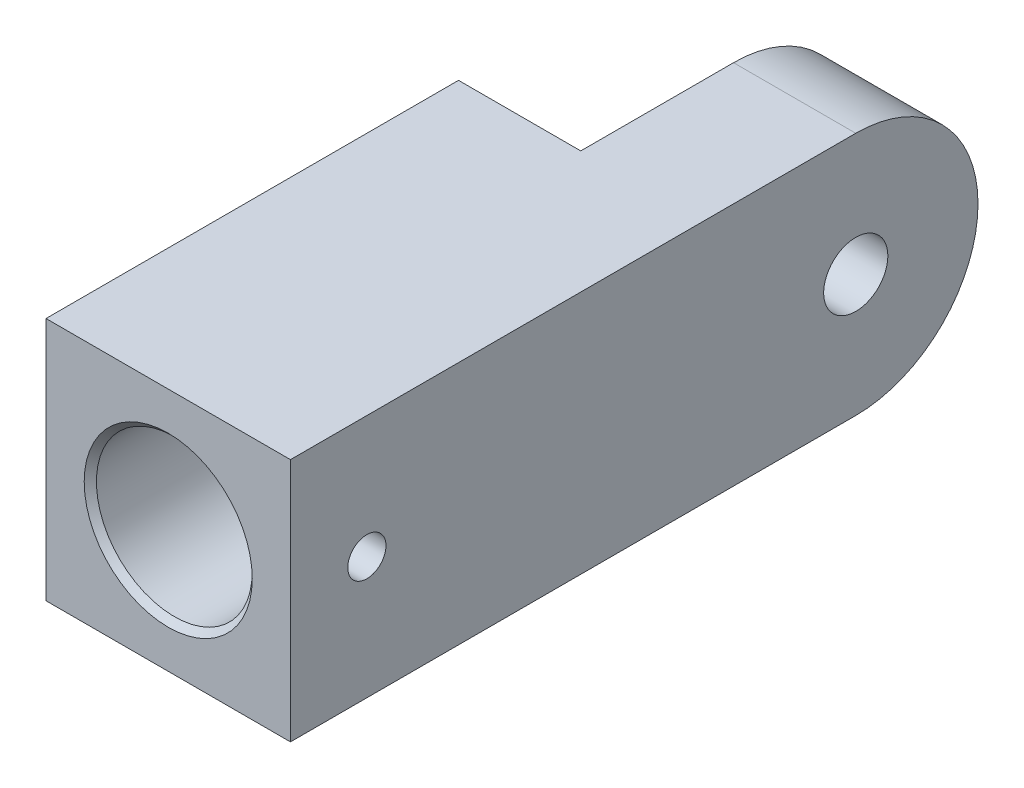
ISO-10303-21;
HEADER;
FILE_DESCRIPTION(('STEP AP214'),'2;1');
FILE_NAME('part.step','',(''),(''),'','','');
FILE_SCHEMA(('AUTOMOTIVE_DESIGN { 1 0 10303 214 1 1 1 1 }'));
ENDSEC;
DATA;
#1=APPLICATION_CONTEXT('core data for automotive mechanical design processes');
#2=APPLICATION_PROTOCOL_DEFINITION('international standard','automotive_design',2000,#1);
#3=PRODUCT_CONTEXT('',#1,'mechanical');
#4=PRODUCT('Part','Part','',(#3));
#5=PRODUCT_RELATED_PRODUCT_CATEGORY('part','',(#4));
#6=PRODUCT_DEFINITION_FORMATION('','',#4);
#7=PRODUCT_DEFINITION_CONTEXT('part definition',#1,'design');
#8=PRODUCT_DEFINITION('design','',#6,#7);
#9=PRODUCT_DEFINITION_SHAPE('','',#8);
#10=(LENGTH_UNIT() NAMED_UNIT(*) SI_UNIT(.MILLI.,.METRE.));
#11=(NAMED_UNIT(*) PLANE_ANGLE_UNIT() SI_UNIT($,.RADIAN.));
#12=(NAMED_UNIT(*) SI_UNIT($,.STERADIAN.) SOLID_ANGLE_UNIT());
#13=UNCERTAINTY_MEASURE_WITH_UNIT(LENGTH_MEASURE(1.E-05),#10,'distance_accuracy_value','');
#14=(GEOMETRIC_REPRESENTATION_CONTEXT(3) GLOBAL_UNCERTAINTY_ASSIGNED_CONTEXT((#13)) GLOBAL_UNIT_ASSIGNED_CONTEXT((#10,
#11,#12)) REPRESENTATION_CONTEXT('',''));
#15=CARTESIAN_POINT('',(0.,0.,0.));
#16=DIRECTION('',(0.,0.,1.));
#17=DIRECTION('',(1.,0.,0.));
#18=AXIS2_PLACEMENT_3D('',#15,#16,#17);
#19=CARTESIAN_POINT('',(8.,8.,45.));
#20=DIRECTION('',(0.,-1.,0.));
#21=DIRECTION('',(1.,0.,0.));
#22=AXIS2_PLACEMENT_3D('',#19,#20,#21);
#23=PLANE('',#22);
#24=DIRECTION('',(-1.,0.,0.));
#25=VECTOR('',#24,1.);
#26=CARTESIAN_POINT('',(8.,8.,8.));
#27=LINE('',#26,#25);
#28=CARTESIAN_POINT('',(8.,8.,8.));
#29=VERTEX_POINT('',#28);
#30=CARTESIAN_POINT('',(0.,8.,8.));
#31=VERTEX_POINT('',#30);
#32=EDGE_CURVE('E124',#29,#31,#27,.T.);
#33=ORIENTED_EDGE('',*,*,#32,.T.);
#34=DIRECTION('',(0.,0.,-1.));
#35=VECTOR('',#34,1.);
#36=CARTESIAN_POINT('',(0.,8.,0.));
#37=LINE('',#36,#35);
#38=CARTESIAN_POINT('',(0.,8.,18.));
#39=VERTEX_POINT('',#38);
#40=EDGE_CURVE('E138',#39,#31,#37,.T.);
#41=ORIENTED_EDGE('',*,*,#40,.F.);
#42=DIRECTION('',(1.,0.,0.));
#43=VECTOR('',#42,1.);
#44=CARTESIAN_POINT('',(-8.,8.,18.));
#45=LINE('',#44,#43);
#46=CARTESIAN_POINT('',(-8.,8.,18.));
#47=VERTEX_POINT('',#46);
#48=EDGE_CURVE('E134',#47,#39,#45,.T.);
#49=ORIENTED_EDGE('',*,*,#48,.F.);
#50=DIRECTION('',(0.,0.,-1.));
#51=VECTOR('',#50,1.);
#52=CARTESIAN_POINT('',(-8.,8.,45.));
#53=LINE('',#52,#51);
#54=CARTESIAN_POINT('',(-8.,8.,45.));
#55=VERTEX_POINT('',#54);
#56=EDGE_CURVE('E153',#55,#47,#53,.T.);
#57=ORIENTED_EDGE('',*,*,#56,.F.);
#58=DIRECTION('',(-1.,0.,0.));
#59=VECTOR('',#58,1.);
#60=CARTESIAN_POINT('',(8.,8.,45.));
#61=LINE('',#60,#59);
#62=CARTESIAN_POINT('',(8.,8.,45.));
#63=VERTEX_POINT('',#62);
#64=EDGE_CURVE('E58',#63,#55,#61,.T.);
#65=ORIENTED_EDGE('',*,*,#64,.F.);
#66=DIRECTION('',(0.,0.,-1.));
#67=VECTOR('',#66,1.);
#68=CARTESIAN_POINT('',(8.,8.,45.));
#69=LINE('',#68,#67);
#70=EDGE_CURVE('E156',#63,#29,#69,.T.);
#71=ORIENTED_EDGE('',*,*,#70,.T.);
#72=EDGE_LOOP('',(#33,#41,#49,#57,#65,#71));
#73=FACE_BOUND('',#72,.T.);
#74=ADVANCED_FACE('F36',(#73),#23,.F.);
#75=CARTESIAN_POINT('',(-8.,8.,45.));
#76=DIRECTION('',(1.,0.,0.));
#77=DIRECTION('',(0.,1.,0.));
#78=AXIS2_PLACEMENT_3D('',#75,#76,#77);
#79=PLANE('',#78);
#80=ORIENTED_EDGE('',*,*,#56,.T.);
#81=DIRECTION('',(0.,-1.,0.));
#82=VECTOR('',#81,1.);
#83=CARTESIAN_POINT('',(-8.,0.,18.));
#84=LINE('',#83,#82);
#85=CARTESIAN_POINT('',(-8.,-8.,18.));
#86=VERTEX_POINT('',#85);
#87=EDGE_CURVE('E131',#47,#86,#84,.T.);
#88=ORIENTED_EDGE('',*,*,#87,.T.);
#89=DIRECTION('',(0.,0.,-1.));
#90=VECTOR('',#89,1.);
#91=CARTESIAN_POINT('',(-8.,-8.,45.));
#92=LINE('',#91,#90);
#93=CARTESIAN_POINT('',(-8.,-8.,45.));
#94=VERTEX_POINT('',#93);
#95=EDGE_CURVE('E50',#94,#86,#92,.T.);
#96=ORIENTED_EDGE('',*,*,#95,.F.);
#97=DIRECTION('',(0.,-1.,0.));
#98=VECTOR('',#97,1.);
#99=CARTESIAN_POINT('',(-8.,8.,45.));
#100=LINE('',#99,#98);
#101=EDGE_CURVE('E146',#55,#94,#100,.T.);
#102=ORIENTED_EDGE('',*,*,#101,.F.);
#103=EDGE_LOOP('',(#80,#88,#96,#102));
#104=FACE_BOUND('',#103,.T.);
#105=ADVANCED_FACE('F38',(#104),#79,.F.);
#106=CARTESIAN_POINT('',(8.,-8.,45.));
#107=DIRECTION('',(0.,1.,0.));
#108=DIRECTION('',(-1.,0.,0.));
#109=AXIS2_PLACEMENT_3D('',#106,#107,#108);
#110=PLANE('',#109);
#111=DIRECTION('',(0.,0.,-1.));
#112=VECTOR('',#111,1.);
#113=CARTESIAN_POINT('',(0.,-8.,0.));
#114=LINE('',#113,#112);
#115=CARTESIAN_POINT('',(0.,-8.,18.));
#116=VERTEX_POINT('',#115);
#117=CARTESIAN_POINT('',(0.,-8.,8.));
#118=VERTEX_POINT('',#117);
#119=EDGE_CURVE('E130',#116,#118,#114,.T.);
#120=ORIENTED_EDGE('',*,*,#119,.T.);
#121=DIRECTION('',(-1.,0.,0.));
#122=VECTOR('',#121,1.);
#123=CARTESIAN_POINT('',(8.,-8.,8.));
#124=LINE('',#123,#122);
#125=CARTESIAN_POINT('',(8.,-8.,8.));
#126=VERTEX_POINT('',#125);
#127=EDGE_CURVE('E127',#126,#118,#124,.T.);
#128=ORIENTED_EDGE('',*,*,#127,.F.);
#129=DIRECTION('',(0.,0.,-1.));
#130=VECTOR('',#129,1.);
#131=CARTESIAN_POINT('',(8.,-8.,45.));
#132=LINE('',#131,#130);
#133=CARTESIAN_POINT('',(8.,-8.,45.));
#134=VERTEX_POINT('',#133);
#135=EDGE_CURVE('E159',#134,#126,#132,.T.);
#136=ORIENTED_EDGE('',*,*,#135,.F.);
#137=DIRECTION('',(1.,0.,0.));
#138=VECTOR('',#137,1.);
#139=CARTESIAN_POINT('',(8.,-8.,45.));
#140=LINE('',#139,#138);
#141=EDGE_CURVE('E149',#94,#134,#140,.T.);
#142=ORIENTED_EDGE('',*,*,#141,.F.);
#143=ORIENTED_EDGE('',*,*,#95,.T.);
#144=DIRECTION('',(1.,0.,0.));
#145=VECTOR('',#144,1.);
#146=CARTESIAN_POINT('',(-8.,-8.,18.));
#147=LINE('',#146,#145);
#148=EDGE_CURVE('E143',#86,#116,#147,.T.);
#149=ORIENTED_EDGE('',*,*,#148,.T.);
#150=EDGE_LOOP('',(#120,#128,#136,#142,#143,#149));
#151=FACE_BOUND('',#150,.T.);
#152=ADVANCED_FACE('F188',(#151),#110,.F.);
#153=CARTESIAN_POINT('',(8.,8.,45.));
#154=DIRECTION('',(-1.,0.,0.));
#155=DIRECTION('',(0.,0.,1.));
#156=AXIS2_PLACEMENT_3D('',#153,#154,#155);
#157=PLANE('',#156);
#158=CARTESIAN_POINT('',(8.,0.,40.));
#159=DIRECTION('',(1.,0.,0.));
#160=DIRECTION('',(0.,0.,-1.));
#161=AXIS2_PLACEMENT_3D('',#158,#159,#160);
#162=CIRCLE('',#161,1.25);
#163=CARTESIAN_POINT('',(8.,0.,38.75));
#164=VERTEX_POINT('',#163);
#165=EDGE_CURVE('E109',#164,#164,#162,.T.);
#166=ORIENTED_EDGE('',*,*,#165,.F.);
#167=EDGE_LOOP('',(#166));
#168=FACE_BOUND('',#167,.T.);
#169=CARTESIAN_POINT('',(8.,0.,8.));
#170=DIRECTION('',(1.,0.,0.));
#171=DIRECTION('',(0.,0.,-1.));
#172=AXIS2_PLACEMENT_3D('',#169,#170,#171);
#173=CIRCLE('',#172,2.1);
#174=CARTESIAN_POINT('',(8.,0.,5.9));
#175=VERTEX_POINT('',#174);
#176=EDGE_CURVE('E117',#175,#175,#173,.T.);
#177=ORIENTED_EDGE('',*,*,#176,.F.);
#178=EDGE_LOOP('',(#177));
#179=FACE_BOUND('',#178,.T.);
#180=ORIENTED_EDGE('',*,*,#135,.T.);
#181=CARTESIAN_POINT('',(8.,0.,8.));
#182=DIRECTION('',(1.,0.,0.));
#183=DIRECTION('',(0.,0.,-1.));
#184=AXIS2_PLACEMENT_3D('',#181,#182,#183);
#185=CIRCLE('',#184,8.);
#186=EDGE_CURVE('E121',#126,#29,#185,.T.);
#187=ORIENTED_EDGE('',*,*,#186,.T.);
#188=ORIENTED_EDGE('',*,*,#70,.F.);
#189=DIRECTION('',(0.,1.,0.));
#190=VECTOR('',#189,1.);
#191=CARTESIAN_POINT('',(8.,8.,45.));
#192=LINE('',#191,#190);
#193=EDGE_CURVE('E63',#134,#63,#192,.T.);
#194=ORIENTED_EDGE('',*,*,#193,.F.);
#195=EDGE_LOOP('',(#180,#187,#188,#194));
#196=FACE_BOUND('',#195,.T.);
#197=ADVANCED_FACE('F194',(#168,#179,#196),#157,.F.);
#198=CARTESIAN_POINT('',(0.,0.,45.));
#199=DIRECTION('',(0.,0.,-1.));
#200=DIRECTION('',(-1.,0.,0.));
#201=AXIS2_PLACEMENT_3D('',#198,#199,#200);
#202=PLANE('',#201);
#203=CARTESIAN_POINT('',(0.,0.,45.));
#204=DIRECTION('',(0.,0.,1.));
#205=DIRECTION('',(1.,0.,0.));
#206=AXIS2_PLACEMENT_3D('',#203,#204,#205);
#207=CIRCLE('',#206,5.5);
#208=CARTESIAN_POINT('',(5.5,0.,45.));
#209=VERTEX_POINT('',#208);
#210=EDGE_CURVE('E111',#209,#209,#207,.T.);
#211=ORIENTED_EDGE('',*,*,#210,.F.);
#212=EDGE_LOOP('',(#211));
#213=FACE_BOUND('',#212,.T.);
#214=ORIENTED_EDGE('',*,*,#101,.T.);
#215=ORIENTED_EDGE('',*,*,#141,.T.);
#216=ORIENTED_EDGE('',*,*,#193,.T.);
#217=ORIENTED_EDGE('',*,*,#64,.T.);
#218=EDGE_LOOP('',(#214,#215,#216,#217));
#219=FACE_BOUND('',#218,.T.);
#220=ADVANCED_FACE('F192',(#213,#219),#202,.F.);
#221=CARTESIAN_POINT('',(-8.,0.,18.));
#222=DIRECTION('',(0.,0.,1.));
#223=DIRECTION('',(0.,-1.,0.));
#224=AXIS2_PLACEMENT_3D('',#221,#222,#223);
#225=PLANE('',#224);
#226=DIRECTION('',(0.,-1.,0.));
#227=VECTOR('',#226,1.);
#228=CARTESIAN_POINT('',(0.,0.,18.));
#229=LINE('',#228,#227);
#230=EDGE_CURVE('E135',#39,#116,#229,.T.);
#231=ORIENTED_EDGE('',*,*,#230,.T.);
#232=ORIENTED_EDGE('',*,*,#148,.F.);
#233=ORIENTED_EDGE('',*,*,#87,.F.);
#234=ORIENTED_EDGE('',*,*,#48,.T.);
#235=EDGE_LOOP('',(#231,#232,#233,#234));
#236=FACE_BOUND('',#235,.T.);
#237=ADVANCED_FACE('F206',(#236),#225,.F.);
#238=CARTESIAN_POINT('',(0.,0.,0.));
#239=DIRECTION('',(1.,0.,0.));
#240=DIRECTION('',(0.,0.,-1.));
#241=AXIS2_PLACEMENT_3D('',#238,#239,#240);
#242=PLANE('',#241);
#243=CARTESIAN_POINT('',(0.,0.,8.));
#244=DIRECTION('',(1.,0.,0.));
#245=DIRECTION('',(0.,0.,-1.));
#246=AXIS2_PLACEMENT_3D('',#243,#244,#245);
#247=CIRCLE('',#246,2.1);
#248=CARTESIAN_POINT('',(0.,0.,5.9));
#249=VERTEX_POINT('',#248);
#250=EDGE_CURVE('E120',#249,#249,#247,.T.);
#251=ORIENTED_EDGE('',*,*,#250,.T.);
#252=EDGE_LOOP('',(#251));
#253=FACE_BOUND('',#252,.T.);
#254=CARTESIAN_POINT('',(0.,0.,8.));
#255=DIRECTION('',(1.,0.,0.));
#256=DIRECTION('',(0.,0.,-1.));
#257=AXIS2_PLACEMENT_3D('',#254,#255,#256);
#258=CIRCLE('',#257,8.);
#259=EDGE_CURVE('E11',#31,#118,#258,.F.);
#260=ORIENTED_EDGE('',*,*,#259,.T.);
#261=ORIENTED_EDGE('',*,*,#119,.F.);
#262=ORIENTED_EDGE('',*,*,#230,.F.);
#263=ORIENTED_EDGE('',*,*,#40,.T.);
#264=EDGE_LOOP('',(#260,#261,#262,#263));
#265=FACE_BOUND('',#264,.T.);
#266=ADVANCED_FACE('F166',(#253,#265),#242,.F.);
#267=CARTESIAN_POINT('',(8.,0.,8.));
#268=DIRECTION('',(-1.,0.,0.));
#269=DIRECTION('',(0.,0.,1.));
#270=AXIS2_PLACEMENT_3D('',#267,#268,#269);
#271=CYLINDRICAL_SURFACE('',#270,8.);
#272=ORIENTED_EDGE('',*,*,#259,.F.);
#273=ORIENTED_EDGE('',*,*,#32,.F.);
#274=ORIENTED_EDGE('',*,*,#186,.F.);
#275=ORIENTED_EDGE('',*,*,#127,.T.);
#276=EDGE_LOOP('',(#272,#273,#274,#275));
#277=FACE_BOUND('',#276,.T.);
#278=ADVANCED_FACE('F172',(#277),#271,.T.);
#279=CARTESIAN_POINT('',(8.,0.,8.));
#280=DIRECTION('',(1.,0.,0.));
#281=DIRECTION('',(0.,0.,-1.));
#282=AXIS2_PLACEMENT_3D('',#279,#280,#281);
#283=CYLINDRICAL_SURFACE('',#282,2.1);
#284=ORIENTED_EDGE('',*,*,#176,.T.);
#285=EDGE_LOOP('',(#284));
#286=FACE_BOUND('',#285,.T.);
#287=ORIENTED_EDGE('',*,*,#250,.F.);
#288=EDGE_LOOP('',(#287));
#289=FACE_BOUND('',#288,.T.);
#290=ADVANCED_FACE('F169',(#286,#289),#283,.F.);
#291=CARTESIAN_POINT('',(8.,0.,40.));
#292=DIRECTION('',(1.,0.,0.));
#293=DIRECTION('',(0.,0.,-1.));
#294=AXIS2_PLACEMENT_3D('',#291,#292,#293);
#295=CYLINDRICAL_SURFACE('',#294,1.25);
#296=CARTESIAN_POINT('',(5.1,0.,38.75));
#297=CARTESIAN_POINT('',(5.09999880434979,-0.0691070684996925,38.7500020165109));
#298=CARTESIAN_POINT('',(5.09858131536653,-0.138236944418446,38.7557502377163));
#299=CARTESIAN_POINT('',(5.09306394414273,-0.274518328542682,38.7785585629587));
#300=CARTESIAN_POINT('',(5.08896247642348,-0.34166864286499,38.7956253531758));
#301=CARTESIAN_POINT('',(5.07853173481307,-0.472002952228093,38.8404925553834));
#302=CARTESIAN_POINT('',(5.07220508043732,-0.535191508483105,38.8682803501969));
#303=CARTESIAN_POINT('',(5.05799923545459,-0.656009783807288,38.9337570747495));
#304=CARTESIAN_POINT('',(5.05012000732641,-0.71363936848209,38.9714462437834));
#305=CARTESIAN_POINT('',(5.03349079831523,-0.822848252966838,39.0564464383293));
#306=CARTESIAN_POINT('',(5.02472780422834,-0.874301457474937,39.1039169353936));
#307=CARTESIAN_POINT('',(5.00740600303306,-0.96860149051342,39.2067906907256));
#308=CARTESIAN_POINT('',(4.99884721820992,-1.01144738348377,39.2621948102078));
#309=CARTESIAN_POINT('',(4.98277220490615,-1.0879035028578,39.3803344515879));
#310=CARTESIAN_POINT('',(4.9752725239875,-1.1213738013313,39.4431629859324));
#311=CARTESIAN_POINT('',(4.96235417524496,-1.17722916418205,39.5737681418392));
#312=CARTESIAN_POINT('',(4.95693518890104,-1.1996159254181,39.6415440041553));
#313=CARTESIAN_POINT('',(4.94892534918552,-1.23224077227212,39.7787363247121));
#314=CARTESIAN_POINT('',(4.94628192270403,-1.24270502580646,39.8480958595413));
#315=CARTESIAN_POINT('',(4.94396505119134,-1.2518920997985,39.9876324709265));
#316=CARTESIAN_POINT('',(4.94429114286616,-1.25061675182797,40.0578094182464));
#317=CARTESIAN_POINT('',(4.94782914866116,-1.23654152995141,40.1952641722533));
#318=CARTESIAN_POINT('',(4.9509738595344,-1.22401001756152,40.2625714574792));
#319=CARTESIAN_POINT('',(4.95968781619626,-1.18820580162089,40.3940980498247));
#320=CARTESIAN_POINT('',(4.9652572287173,-1.16493235940441,40.4583171442504));
#321=CARTESIAN_POINT('',(4.97825548132943,-1.10807335491485,40.5825697258023));
#322=CARTESIAN_POINT('',(4.98570192341189,-1.07438945055791,40.6425562921717));
#323=CARTESIAN_POINT('',(5.00160513396375,-0.997734518212737,40.7561224624407));
#324=CARTESIAN_POINT('',(5.01006207277567,-0.954761923411034,40.8097009830617));
#325=CARTESIAN_POINT('',(5.02731725106061,-0.859354317594717,40.9104692771806));
#326=CARTESIAN_POINT('',(5.03611849726846,-0.806692545166492,40.9574440979085));
#327=CARTESIAN_POINT('',(5.05286158733432,-0.694134178054512,41.0419355926126));
#328=CARTESIAN_POINT('',(5.06080340690474,-0.634237379008401,41.0794519993317));
#329=CARTESIAN_POINT('',(5.07496988361232,-0.50860985961295,41.1440363033431));
#330=CARTESIAN_POINT('',(5.0811889683056,-0.44286109577459,41.1710704042116));
#331=CARTESIAN_POINT('',(5.09116862078237,-0.307566171137276,41.2136431882088));
#332=CARTESIAN_POINT('',(5.09492964005614,-0.238020710248735,41.2291839824637));
#333=CARTESIAN_POINT('',(5.09950300203925,-0.0989453142746352,41.2480033211648));
#334=CARTESIAN_POINT('',(5.10038575477826,-0.0294572667514434,41.2515747305345));
#335=CARTESIAN_POINT('',(5.09930312829893,0.109123373763242,41.2471556093645));
#336=CARTESIAN_POINT('',(5.09733799487026,0.178216000365267,41.2391660766036));
#337=CARTESIAN_POINT('',(5.09082541313748,0.313034626367916,41.2120935472766));
#338=CARTESIAN_POINT('',(5.08631494103106,0.378794452619996,41.1931693073307));
#339=CARTESIAN_POINT('',(5.07521932825952,0.506203454443049,41.1449450407605));
#340=CARTESIAN_POINT('',(5.06863398290122,0.567852223717143,41.1156439903937));
#341=CARTESIAN_POINT('',(5.05394953642363,0.686461955962984,41.0469233066112));
#342=CARTESIAN_POINT('',(5.04582634854577,0.743324059126191,41.0073383135403));
#343=CARTESIAN_POINT('',(5.02900694161716,0.849702675725456,40.9193858033341));
#344=CARTESIAN_POINT('',(5.02031062787397,0.899217970898001,40.8710168325714));
#345=CARTESIAN_POINT('',(5.00307328773868,0.990696382723899,40.7655119086836));
#346=CARTESIAN_POINT('',(4.99454072619954,1.03245444963733,40.7081964929428));
#347=CARTESIAN_POINT('',(4.9788261359557,1.10575822346969,40.5871978735137));
#348=CARTESIAN_POINT('',(4.97164404691532,1.13730438667597,40.5235149545041));
#349=CARTESIAN_POINT('',(4.95952136957446,1.1890561697623,40.3919339822122));
#350=CARTESIAN_POINT('',(4.95456754355924,1.20932893763629,40.3240636215546));
#351=CARTESIAN_POINT('',(4.94744732527486,1.2381394598066,40.1857387366966));
#352=CARTESIAN_POINT('',(4.94528035148441,1.24667966231571,40.115284754767));
#353=CARTESIAN_POINT('',(4.94402228162177,1.25165848529287,39.97587576824));
#354=CARTESIAN_POINT('',(4.94484800382851,1.2484243607539,39.9069330109691));
#355=CARTESIAN_POINT('',(4.94929065899866,1.2306924450603,39.7706079014838));
#356=CARTESIAN_POINT('',(4.952907540025,1.21619486349272,39.7032255202586));
#357=CARTESIAN_POINT('',(4.96247954352292,1.17652305640476,39.5722739046824));
#358=CARTESIAN_POINT('',(4.9684217046624,1.15140795267151,39.5086857472011));
#359=CARTESIAN_POINT('',(4.98197703107666,1.09126121671283,39.3865812546914));
#360=CARTESIAN_POINT('',(4.98959041906046,1.05622826264648,39.3280655970794));
#361=CARTESIAN_POINT('',(5.00586943046763,0.976204563183662,39.2161804005758));
#362=CARTESIAN_POINT('',(5.01455668828479,0.930985706061678,39.1629771336555));
#363=CARTESIAN_POINT('',(5.03187294207899,0.832321323332238,39.0648072134256));
#364=CARTESIAN_POINT('',(5.04050192381697,0.778873858036758,39.0198425076377));
#365=CARTESIAN_POINT('',(5.05690655619084,0.664158652901534,38.9386730795966));
#366=CARTESIAN_POINT('',(5.0646649532915,0.602772094362,38.9026325414743));
#367=CARTESIAN_POINT('',(5.07827391506525,0.474628080310969,38.8414399612351));
#368=CARTESIAN_POINT('',(5.08412588542531,0.407874627519971,38.8162798919975));
#369=CARTESIAN_POINT('',(5.09236742668302,0.28433916851994,38.7814229674574));
#370=CARTESIAN_POINT('',(5.09521030945108,0.228160130166595,38.7696643112467));
#371=CARTESIAN_POINT('',(5.09902702732158,0.114659241633676,38.7539522615779));
#372=CARTESIAN_POINT('',(5.10000099201949,0.0573374709725584,38.7499983269203));
#373=CARTESIAN_POINT('',(5.1,0.,38.75));
#374=B_SPLINE_CURVE_WITH_KNOTS('',3,(#296,#297,#298,#299,#300,#301,#302,#303,#304,#305,#306,
#307,#308,#309,#310,#311,#312,#313,#314,#315,#316,#317,#318,#319,#320,#321,#322,#323,#324,#325,
#326,#327,#328,#329,#330,#331,#332,#333,#334,#335,#336,#337,#338,#339,#340,#341,#342,#343,#344,
#345,#346,#347,#348,#349,#350,#351,#352,#353,#354,#355,#356,#357,#358,#359,#360,#361,#362,#363,
#364,#365,#366,#367,#368,#369,#370,#371,#372,#373),.UNSPECIFIED.,.T.,.F.,(4,2,2,2,2,2,2,2,2,2,2,
2,2,2,2,2,2,2,2,2,2,2,2,2,2,2,2,2,2,2,2,2,2,2,2,2,2,2,4),(0.,0.207111126001138,
0.414344707167141,0.621335142633991,0.82833058107301,1.03901413705268,1.2497205806197,
1.46342191841654,1.67709052900647,1.88663462873633,2.09614603667921,2.30079124414468,
2.50545052607679,2.71210547153033,2.91879530271747,3.1311412630626,3.34349322278761,
3.55652425234779,3.76951614198416,3.97725697741624,4.1849798846347,4.38976012844558,
4.59456058084085,4.80288334137089,5.01124060791518,5.22449909344892,5.4377480488709,
5.64971283372679,5.8616333815604,6.06770935164209,6.27378148721519,6.47872095452596,
6.68368774882848,6.89380526695211,7.10397239106231,7.31775867260691,7.53138696205187,
7.70323699097113,7.87507510294715),.UNSPECIFIED.);
#375=CARTESIAN_POINT('',(5.1,0.,38.75));
#376=VERTEX_POINT('',#375);
#377=EDGE_CURVE('E40',#376,#376,#374,.T.);
#378=ORIENTED_EDGE('',*,*,#377,.T.);
#379=EDGE_LOOP('',(#378));
#380=FACE_BOUND('',#379,.T.);
#381=ORIENTED_EDGE('',*,*,#165,.T.);
#382=EDGE_LOOP('',(#381));
#383=FACE_BOUND('',#382,.T.);
#384=ADVANCED_FACE('F171',(#380,#383),#295,.F.);
#385=CARTESIAN_POINT('',(0.,0.,45.));
#386=DIRECTION('',(0.,0.,1.));
#387=DIRECTION('',(1.,0.,0.));
#388=AXIS2_PLACEMENT_3D('',#385,#386,#387);
#389=CYLINDRICAL_SURFACE('',#388,5.1);
#390=CARTESIAN_POINT('',(0.,0.,44.6));
#391=DIRECTION('',(0.,0.,1.));
#392=DIRECTION('',(1.,0.,0.));
#393=AXIS2_PLACEMENT_3D('',#390,#391,#392);
#394=CIRCLE('',#393,5.1);
#395=CARTESIAN_POINT('',(5.1,0.,44.6));
#396=VERTEX_POINT('',#395);
#397=EDGE_CURVE('E106',#396,#396,#394,.T.);
#398=ORIENTED_EDGE('',*,*,#397,.T.);
#399=EDGE_LOOP('',(#398));
#400=FACE_BOUND('',#399,.T.);
#401=CARTESIAN_POINT('',(0.,0.,33.0643891570406));
#402=DIRECTION('',(0.,0.,1.));
#403=DIRECTION('',(1.,0.,0.));
#404=AXIS2_PLACEMENT_3D('',#401,#402,#403);
#405=CIRCLE('',#404,5.1);
#406=CARTESIAN_POINT('',(5.1,0.,33.0643891570406));
#407=VERTEX_POINT('',#406);
#408=EDGE_CURVE('E104',#407,#407,#405,.T.);
#409=ORIENTED_EDGE('',*,*,#408,.F.);
#410=EDGE_LOOP('',(#409));
#411=FACE_BOUND('',#410,.T.);
#412=ORIENTED_EDGE('',*,*,#377,.F.);
#413=EDGE_LOOP('',(#412));
#414=FACE_BOUND('',#413,.T.);
#415=ADVANCED_FACE('F100',(#400,#411,#414),#389,.F.);
#416=CARTESIAN_POINT('',(0.,0.,33.0643891570406));
#417=DIRECTION('',(0.,0.,1.));
#418=DIRECTION('',(1.,0.,0.));
#419=AXIS2_PLACEMENT_3D('',#416,#417,#418);
#420=CONICAL_SURFACE('',#419,5.1,1.02974425867665);
#421=CARTESIAN_POINT('',(0.,0.,30.));
#422=VERTEX_POINT('',#421);
#423=VERTEX_LOOP('',#422);
#424=FACE_BOUND('',#423,.T.);
#425=ORIENTED_EDGE('',*,*,#408,.T.);
#426=EDGE_LOOP('',(#425));
#427=FACE_BOUND('',#426,.T.);
#428=ADVANCED_FACE('F96',(#424,#427),#420,.F.);
#429=CARTESIAN_POINT('',(0.,0.,45.));
#430=DIRECTION('',(0.,0.,1.));
#431=DIRECTION('',(1.,0.,0.));
#432=AXIS2_PLACEMENT_3D('',#429,#430,#431);
#433=CONICAL_SURFACE('',#432,5.5,0.785398163397453);
#434=ORIENTED_EDGE('',*,*,#397,.F.);
#435=EDGE_LOOP('',(#434));
#436=FACE_BOUND('',#435,.T.);
#437=ORIENTED_EDGE('',*,*,#210,.T.);
#438=EDGE_LOOP('',(#437));
#439=FACE_BOUND('',#438,.T.);
#440=ADVANCED_FACE('F99',(#436,#439),#433,.F.);
#441=CLOSED_SHELL('',(#74,#105,#152,#197,#220,#237,#266,#278,#290,#384,#415,#428,#440));
#442=MANIFOLD_SOLID_BREP('B2',#441);
#443=ADVANCED_BREP_SHAPE_REPRESENTATION('',(#18,#442),#14);
#444=SHAPE_DEFINITION_REPRESENTATION(#9,#443);
ENDSEC;
END-ISO-10303-21;
